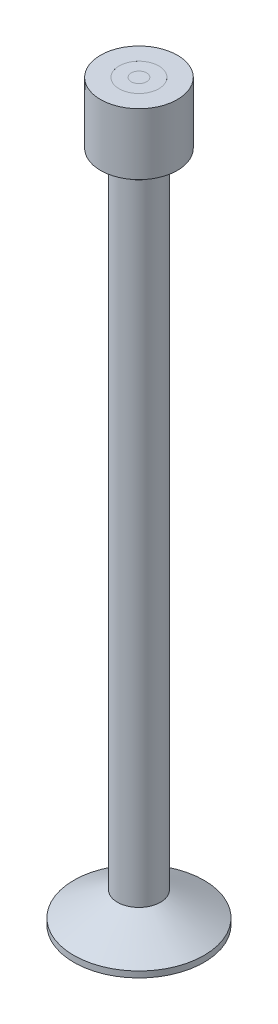
ISO-10303-21;
HEADER;
FILE_DESCRIPTION(('STEP AP214'),'2;1');
FILE_NAME('part.step','',(''),(''),'','','');
FILE_SCHEMA(('AUTOMOTIVE_DESIGN { 1 0 10303 214 1 1 1 1 }'));
ENDSEC;
DATA;
#1=APPLICATION_CONTEXT('core data for automotive mechanical design processes');
#2=APPLICATION_PROTOCOL_DEFINITION('international standard','automotive_design',2000,#1);
#3=PRODUCT_CONTEXT('',#1,'mechanical');
#4=PRODUCT('Part','Part','',(#3));
#5=PRODUCT_RELATED_PRODUCT_CATEGORY('part','',(#4));
#6=PRODUCT_DEFINITION_FORMATION('','',#4);
#7=PRODUCT_DEFINITION_CONTEXT('part definition',#1,'design');
#8=PRODUCT_DEFINITION('design','',#6,#7);
#9=PRODUCT_DEFINITION_SHAPE('','',#8);
#10=(LENGTH_UNIT() NAMED_UNIT(*) SI_UNIT(.MILLI.,.METRE.));
#11=(NAMED_UNIT(*) PLANE_ANGLE_UNIT() SI_UNIT($,.RADIAN.));
#12=(NAMED_UNIT(*) SI_UNIT($,.STERADIAN.) SOLID_ANGLE_UNIT());
#13=UNCERTAINTY_MEASURE_WITH_UNIT(LENGTH_MEASURE(1.E-05),#10,'distance_accuracy_value','');
#14=(GEOMETRIC_REPRESENTATION_CONTEXT(3) GLOBAL_UNCERTAINTY_ASSIGNED_CONTEXT((#13)) GLOBAL_UNIT_ASSIGNED_CONTEXT((#10,
#11,#12)) REPRESENTATION_CONTEXT('',''));
#15=CARTESIAN_POINT('',(0.,0.,0.));
#16=DIRECTION('',(0.,0.,1.));
#17=DIRECTION('',(1.,0.,0.));
#18=AXIS2_PLACEMENT_3D('',#15,#16,#17);
#19=CARTESIAN_POINT('',(1.37500000000001,0.100000000000002,0.));
#20=DIRECTION('',(0.,1.,0.));
#21=DIRECTION('',(0.,0.,1.));
#22=AXIS2_PLACEMENT_3D('',#19,#20,#21);
#23=PLANE('',#22);
#24=CARTESIAN_POINT('',(0.,0.100000000000002,0.));
#25=DIRECTION('',(0.,1.,0.));
#26=DIRECTION('',(0.,0.,1.));
#27=AXIS2_PLACEMENT_3D('',#24,#25,#26);
#28=CIRCLE('',#27,1.37500000000001);
#29=CARTESIAN_POINT('',(0.,0.100000000000002,1.37500000000001));
#30=VERTEX_POINT('',#29);
#31=EDGE_CURVE('E11',#30,#30,#28,.F.);
#32=ORIENTED_EDGE('',*,*,#31,.F.);
#33=EDGE_LOOP('',(#32));
#34=FACE_BOUND('',#33,.T.);
#35=ADVANCED_FACE('F42',(#34),#23,.T.);
#36=CARTESIAN_POINT('',(0.,0.,0.));
#37=DIRECTION('',(0.,-1.,0.));
#38=DIRECTION('',(1.,0.,0.));
#39=AXIS2_PLACEMENT_3D('',#36,#37,#38);
#40=PLANE('',#39);
#41=CARTESIAN_POINT('',(0.,0.,0.));
#42=DIRECTION('',(0.,-1.,0.));
#43=DIRECTION('',(1.,0.,0.));
#44=AXIS2_PLACEMENT_3D('',#41,#42,#43);
#45=CIRCLE('',#44,1.37500000000001);
#46=CARTESIAN_POINT('',(1.37500000000001,0.,0.));
#47=VERTEX_POINT('',#46);
#48=EDGE_CURVE('E48',#47,#47,#45,.T.);
#49=ORIENTED_EDGE('',*,*,#48,.T.);
#50=EDGE_LOOP('',(#49));
#51=FACE_BOUND('',#50,.T.);
#52=ADVANCED_FACE('F54',(#51),#40,.T.);
#53=CARTESIAN_POINT('',(0.,3.98908729652604,0.));
#54=DIRECTION('',(0.,-1.,0.));
#55=DIRECTION('',(1.,0.,0.));
#56=AXIS2_PLACEMENT_3D('',#53,#54,#55);
#57=CYLINDRICAL_SURFACE('',#56,1.37500000000001);
#58=ORIENTED_EDGE('',*,*,#48,.F.);
#59=EDGE_LOOP('',(#58));
#60=FACE_BOUND('',#59,.T.);
#61=ORIENTED_EDGE('',*,*,#31,.T.);
#62=EDGE_LOOP('',(#61));
#63=FACE_BOUND('',#62,.T.);
#64=ADVANCED_FACE('F56',(#60,#63),#57,.T.);
#65=CLOSED_SHELL('',(#35,#52,#64));
#66=MANIFOLD_SOLID_BREP('B2',#65);
#67=CARTESIAN_POINT('',(0.,55.5,0.));
#68=DIRECTION('',(0.,1.,0.));
#69=DIRECTION('',(0.,0.,1.));
#70=AXIS2_PLACEMENT_3D('',#67,#68,#69);
#71=CYLINDRICAL_SURFACE('',#70,0.375);
#72=CARTESIAN_POINT('',(0.,0.100000000000003,0.));
#73=DIRECTION('',(0.,1.,0.));
#74=DIRECTION('',(0.,0.,1.));
#75=AXIS2_PLACEMENT_3D('',#72,#73,#74);
#76=CIRCLE('',#75,0.375);
#77=CARTESIAN_POINT('',(0.,0.100000000000003,0.375));
#78=VERTEX_POINT('',#77);
#79=EDGE_CURVE('E113',#78,#78,#76,.T.);
#80=ORIENTED_EDGE('',*,*,#79,.F.);
#81=EDGE_LOOP('',(#80));
#82=FACE_BOUND('',#81,.T.);
#83=CARTESIAN_POINT('',(0.,54.9421933085502,0.));
#84=DIRECTION('',(0.,1.,0.));
#85=DIRECTION('',(0.,0.,1.));
#86=AXIS2_PLACEMENT_3D('',#83,#84,#85);
#87=CIRCLE('',#86,0.375);
#88=CARTESIAN_POINT('',(0.,54.9421933085502,0.375));
#89=VERTEX_POINT('',#88);
#90=EDGE_CURVE('E41',#89,#89,#87,.T.);
#91=ORIENTED_EDGE('',*,*,#90,.T.);
#92=EDGE_LOOP('',(#91));
#93=FACE_BOUND('',#92,.T.);
#94=ADVANCED_FACE('F91',(#82,#93),#71,.F.);
#95=CARTESIAN_POINT('',(0.,60.571,0.));
#96=DIRECTION('',(0.,1.,0.));
#97=DIRECTION('',(0.,0.,1.));
#98=AXIS2_PLACEMENT_3D('',#95,#96,#97);
#99=CONICAL_SURFACE('',#98,0.635000000000092,0.0461581536129454);
#100=ORIENTED_EDGE('',*,*,#90,.F.);
#101=EDGE_LOOP('',(#100));
#102=FACE_BOUND('',#101,.T.);
#103=CARTESIAN_POINT('',(0.,60.571,0.));
#104=DIRECTION('',(0.,1.,0.));
#105=DIRECTION('',(0.,0.,1.));
#106=AXIS2_PLACEMENT_3D('',#103,#104,#105);
#107=CIRCLE('',#106,0.635000000000092);
#108=CARTESIAN_POINT('',(0.,60.571,0.635000000000092));
#109=VERTEX_POINT('',#108);
#110=EDGE_CURVE('E97',#109,#109,#107,.T.);
#111=ORIENTED_EDGE('',*,*,#110,.T.);
#112=EDGE_LOOP('',(#111));
#113=FACE_BOUND('',#112,.T.);
#114=ADVANCED_FACE('F120',(#102,#113),#99,.F.);
#115=CARTESIAN_POINT('',(0.635000000000092,60.571,0.));
#116=DIRECTION('',(0.,-1.,0.));
#117=DIRECTION('',(0.,0.,-1.));
#118=AXIS2_PLACEMENT_3D('',#115,#116,#117);
#119=PLANE('',#118);
#120=ORIENTED_EDGE('',*,*,#110,.F.);
#121=EDGE_LOOP('',(#120));
#122=FACE_BOUND('',#121,.T.);
#123=CARTESIAN_POINT('',(0.,60.571,0.));
#124=DIRECTION('',(0.,1.,0.));
#125=DIRECTION('',(0.,0.,1.));
#126=AXIS2_PLACEMENT_3D('',#123,#124,#125);
#127=CIRCLE('',#126,1.63500000000009);
#128=CARTESIAN_POINT('',(0.,60.571,1.63500000000009));
#129=VERTEX_POINT('',#128);
#130=EDGE_CURVE('E101',#129,#129,#127,.T.);
#131=ORIENTED_EDGE('',*,*,#130,.T.);
#132=EDGE_LOOP('',(#131));
#133=FACE_BOUND('',#132,.T.);
#134=ADVANCED_FACE('F124',(#122,#133),#119,.F.);
#135=CARTESIAN_POINT('',(0.,54.9421933085502,0.));
#136=DIRECTION('',(0.,1.,0.));
#137=DIRECTION('',(0.,0.,1.));
#138=AXIS2_PLACEMENT_3D('',#135,#136,#137);
#139=CONICAL_SURFACE('',#138,1.37500000000001,0.0461581536129434);
#140=ORIENTED_EDGE('',*,*,#130,.F.);
#141=EDGE_LOOP('',(#140));
#142=FACE_BOUND('',#141,.T.);
#143=CARTESIAN_POINT('',(0.,54.9421933085502,0.));
#144=DIRECTION('',(0.,1.,0.));
#145=DIRECTION('',(0.,0.,1.));
#146=AXIS2_PLACEMENT_3D('',#143,#144,#145);
#147=CIRCLE('',#146,1.37500000000001);
#148=CARTESIAN_POINT('',(0.,54.9421933085502,1.37500000000001));
#149=VERTEX_POINT('',#148);
#150=EDGE_CURVE('E105',#149,#149,#147,.T.);
#151=ORIENTED_EDGE('',*,*,#150,.T.);
#152=EDGE_LOOP('',(#151));
#153=FACE_BOUND('',#152,.T.);
#154=ADVANCED_FACE('F129',(#142,#153),#139,.T.);
#155=CARTESIAN_POINT('',(0.,55.5,0.));
#156=DIRECTION('',(0.,1.,0.));
#157=DIRECTION('',(0.,0.,1.));
#158=AXIS2_PLACEMENT_3D('',#155,#156,#157);
#159=CYLINDRICAL_SURFACE('',#158,1.37500000000001);
#160=ORIENTED_EDGE('',*,*,#150,.F.);
#161=EDGE_LOOP('',(#160));
#162=FACE_BOUND('',#161,.T.);
#163=CARTESIAN_POINT('',(0.,0.100000000000003,0.));
#164=DIRECTION('',(0.,1.,0.));
#165=DIRECTION('',(0.,0.,1.));
#166=AXIS2_PLACEMENT_3D('',#163,#164,#165);
#167=CIRCLE('',#166,1.37500000000001);
#168=CARTESIAN_POINT('',(0.,0.100000000000003,1.37500000000001));
#169=VERTEX_POINT('',#168);
#170=EDGE_CURVE('E110',#169,#169,#167,.T.);
#171=ORIENTED_EDGE('',*,*,#170,.T.);
#172=EDGE_LOOP('',(#171));
#173=FACE_BOUND('',#172,.T.);
#174=ADVANCED_FACE('F135',(#162,#173),#159,.T.);
#175=CARTESIAN_POINT('',(1.37500000000001,0.100000000000002,0.));
#176=DIRECTION('',(0.,1.,0.));
#177=DIRECTION('',(0.,0.,1.));
#178=AXIS2_PLACEMENT_3D('',#175,#176,#177);
#179=PLANE('',#178);
#180=ORIENTED_EDGE('',*,*,#170,.F.);
#181=EDGE_LOOP('',(#180));
#182=FACE_BOUND('',#181,.T.);
#183=ORIENTED_EDGE('',*,*,#79,.T.);
#184=EDGE_LOOP('',(#183));
#185=FACE_BOUND('',#184,.T.);
#186=ADVANCED_FACE('F117',(#182,#185),#179,.F.);
#187=CLOSED_SHELL('',(#94,#114,#134,#154,#174,#186));
#188=MANIFOLD_SOLID_BREP('B6',#187);
#189=CARTESIAN_POINT('',(1.37500000000001,0.,0.));
#190=DIRECTION('',(0.,1.,0.));
#191=DIRECTION('',(-1.,0.,0.));
#192=AXIS2_PLACEMENT_3D('',#189,#190,#191);
#193=PLANE('',#192);
#194=CARTESIAN_POINT('',(0.,0.,0.));
#195=DIRECTION('',(0.,1.,0.));
#196=DIRECTION('',(-1.,0.,0.));
#197=AXIS2_PLACEMENT_3D('',#194,#195,#196);
#198=CIRCLE('',#197,5.37499999999999);
#199=CARTESIAN_POINT('',(-5.37499999999999,0.,0.));
#200=VERTEX_POINT('',#199);
#201=EDGE_CURVE('E90',#200,#200,#198,.T.);
#202=ORIENTED_EDGE('',*,*,#201,.F.);
#203=EDGE_LOOP('',(#202));
#204=FACE_BOUND('',#203,.T.);
#205=CARTESIAN_POINT('',(0.,0.,0.));
#206=DIRECTION('',(0.,1.,0.));
#207=DIRECTION('',(-1.,0.,0.));
#208=AXIS2_PLACEMENT_3D('',#205,#206,#207);
#209=CIRCLE('',#208,1.375);
#210=CARTESIAN_POINT('',(-1.37499999999999,0.,0.));
#211=VERTEX_POINT('',#210);
#212=EDGE_CURVE('E221',#211,#211,#209,.T.);
#213=ORIENTED_EDGE('',*,*,#212,.T.);
#214=EDGE_LOOP('',(#213));
#215=FACE_BOUND('',#214,.T.);
#216=ADVANCED_FACE('F190',(#204,#215),#193,.F.);
#217=CARTESIAN_POINT('',(0.,60.571,0.));
#218=DIRECTION('',(0.,1.,0.));
#219=DIRECTION('',(-1.,0.,0.));
#220=AXIS2_PLACEMENT_3D('',#217,#218,#219);
#221=CYLINDRICAL_SURFACE('',#220,5.37499999999999);
#222=CARTESIAN_POINT('',(0.,0.5,0.));
#223=DIRECTION('',(0.,1.,0.));
#224=DIRECTION('',(-1.,0.,0.));
#225=AXIS2_PLACEMENT_3D('',#222,#223,#224);
#226=CIRCLE('',#225,5.37499999999999);
#227=CARTESIAN_POINT('',(5.375,0.500000000000001,0.));
#228=VERTEX_POINT('',#227);
#229=EDGE_CURVE('E196',#228,#228,#226,.T.);
#230=ORIENTED_EDGE('',*,*,#229,.F.);
#231=EDGE_LOOP('',(#230));
#232=FACE_BOUND('',#231,.T.);
#233=ORIENTED_EDGE('',*,*,#201,.T.);
#234=EDGE_LOOP('',(#233));
#235=FACE_BOUND('',#234,.T.);
#236=ADVANCED_FACE('F264',(#232,#235),#221,.T.);
#237=CARTESIAN_POINT('',(0.,0.5,0.));
#238=DIRECTION('',(0.,-1.,0.));
#239=DIRECTION('',(1.,0.,0.));
#240=AXIS2_PLACEMENT_3D('',#237,#238,#239);
#241=CONICAL_SURFACE('',#240,5.37499999999999,1.06310757338599);
#242=CARTESIAN_POINT('',(0.,2.5,0.));
#243=DIRECTION('',(0.,1.,0.));
#244=DIRECTION('',(-1.,0.,0.));
#245=AXIS2_PLACEMENT_3D('',#242,#243,#244);
#246=CIRCLE('',#245,1.77999999999999);
#247=CARTESIAN_POINT('',(1.78,2.5,0.));
#248=VERTEX_POINT('',#247);
#249=EDGE_CURVE('E200',#248,#248,#246,.T.);
#250=CARTESIAN_POINT('',(1.78,2.5,0.));
#251=CARTESIAN_POINT('',(1.81744791666667,2.47916666666667,0.));
#252=CARTESIAN_POINT('',(1.85489583333333,2.45833333333334,0.));
#253=CARTESIAN_POINT('',(1.92979166666667,2.41666666666667,0.));
#254=CARTESIAN_POINT('',(1.96723958333333,2.39583333333334,0.));
#255=CARTESIAN_POINT('',(2.04213541666667,2.35416666666667,0.));
#256=CARTESIAN_POINT('',(2.07958333333333,2.33333333333334,0.));
#257=CARTESIAN_POINT('',(2.15447916666667,2.29166666666667,0.));
#258=CARTESIAN_POINT('',(2.19192708333333,2.27083333333334,0.));
#259=CARTESIAN_POINT('',(2.26682291666667,2.22916666666667,0.));
#260=CARTESIAN_POINT('',(2.30427083333333,2.20833333333334,0.));
#261=CARTESIAN_POINT('',(2.37916666666667,2.16666666666667,0.));
#262=CARTESIAN_POINT('',(2.41661458333334,2.14583333333334,0.));
#263=CARTESIAN_POINT('',(2.49151041666667,2.10416666666667,0.));
#264=CARTESIAN_POINT('',(2.52895833333333,2.08333333333334,0.));
#265=CARTESIAN_POINT('',(2.60385416666667,2.04166666666667,0.));
#266=CARTESIAN_POINT('',(2.64130208333333,2.02083333333334,0.));
#267=CARTESIAN_POINT('',(2.71619791666667,1.97916666666667,0.));
#268=CARTESIAN_POINT('',(2.75364583333333,1.95833333333334,0.));
#269=CARTESIAN_POINT('',(2.82854166666667,1.91666666666667,0.));
#270=CARTESIAN_POINT('',(2.86598958333333,1.89583333333334,0.));
#271=CARTESIAN_POINT('',(2.94088541666667,1.85416666666667,0.));
#272=CARTESIAN_POINT('',(2.97833333333333,1.83333333333334,0.));
#273=CARTESIAN_POINT('',(3.05322916666667,1.79166666666667,0.));
#274=CARTESIAN_POINT('',(3.09067708333333,1.77083333333334,0.));
#275=CARTESIAN_POINT('',(3.16557291666667,1.72916666666667,0.));
#276=CARTESIAN_POINT('',(3.20302083333333,1.70833333333334,0.));
#277=CARTESIAN_POINT('',(3.27791666666667,1.66666666666667,0.));
#278=CARTESIAN_POINT('',(3.31536458333333,1.64583333333334,0.));
#279=CARTESIAN_POINT('',(3.39026041666667,1.60416666666667,0.));
#280=CARTESIAN_POINT('',(3.42770833333333,1.58333333333334,0.));
#281=CARTESIAN_POINT('',(3.50260416666667,1.54166666666667,0.));
#282=CARTESIAN_POINT('',(3.54005208333333,1.52083333333334,0.));
#283=CARTESIAN_POINT('',(3.61494791666667,1.47916666666667,0.));
#284=CARTESIAN_POINT('',(3.65239583333333,1.45833333333334,0.));
#285=CARTESIAN_POINT('',(3.72729166666667,1.41666666666667,0.));
#286=CARTESIAN_POINT('',(3.76473958333333,1.39583333333334,0.));
#287=CARTESIAN_POINT('',(3.83963541666667,1.35416666666667,0.));
#288=CARTESIAN_POINT('',(3.87708333333333,1.33333333333334,0.));
#289=CARTESIAN_POINT('',(3.95197916666667,1.29166666666667,0.));
#290=CARTESIAN_POINT('',(3.98942708333333,1.27083333333334,0.));
#291=CARTESIAN_POINT('',(4.06432291666667,1.22916666666667,0.));
#292=CARTESIAN_POINT('',(4.10177083333333,1.20833333333333,0.));
#293=CARTESIAN_POINT('',(4.17666666666667,1.16666666666667,0.));
#294=CARTESIAN_POINT('',(4.21411458333333,1.14583333333333,0.));
#295=CARTESIAN_POINT('',(4.28901041666667,1.10416666666667,0.));
#296=CARTESIAN_POINT('',(4.32645833333333,1.08333333333333,0.));
#297=CARTESIAN_POINT('',(4.40135416666667,1.04166666666667,0.));
#298=CARTESIAN_POINT('',(4.43880208333333,1.02083333333333,0.));
#299=CARTESIAN_POINT('',(4.51369791666667,0.979166666666668,0.));
#300=CARTESIAN_POINT('',(4.55114583333333,0.958333333333335,0.));
#301=CARTESIAN_POINT('',(4.62604166666667,0.916666666666668,0.));
#302=CARTESIAN_POINT('',(4.66348958333333,0.895833333333335,0.));
#303=CARTESIAN_POINT('',(4.73838541666667,0.854166666666668,0.));
#304=CARTESIAN_POINT('',(4.77583333333333,0.833333333333335,0.));
#305=CARTESIAN_POINT('',(4.85072916666667,0.791666666666668,0.));
#306=CARTESIAN_POINT('',(4.88817708333333,0.770833333333334,0.));
#307=CARTESIAN_POINT('',(4.96307291666667,0.729166666666668,0.));
#308=CARTESIAN_POINT('',(5.00052083333333,0.708333333333335,0.));
#309=CARTESIAN_POINT('',(5.07541666666667,0.666666666666668,0.));
#310=CARTESIAN_POINT('',(5.11286458333333,0.645833333333334,0.));
#311=CARTESIAN_POINT('',(5.18776041666667,0.604166666666668,0.));
#312=CARTESIAN_POINT('',(5.22520833333333,0.583333333333334,0.));
#313=CARTESIAN_POINT('',(5.30010416666667,0.541666666666668,0.));
#314=CARTESIAN_POINT('',(5.33755208333333,0.520833333333335,0.));
#315=CARTESIAN_POINT('',(5.375,0.500000000000001,0.));
#316=B_SPLINE_CURVE_WITH_KNOTS('',3,(#250,#251,#252,#253,#254,#255,#256,#257,#258,#259,#260,
#261,#262,#263,#264,#265,#266,#267,#268,#269,#270,#271,#272,#273,#274,#275,#276,#277,#278,#279,
#280,#281,#282,#283,#284,#285,#286,#287,#288,#289,#290,#291,#292,#293,#294,#295,#296,#297,#298,
#299,#300,#301,#302,#303,#304,#305,#306,#307,#308,#309,#310,#311,#312,#313,#314,#315),
.UNSPECIFIED.,.F.,.F.,(4,2,2,2,2,2,2,2,2,2,2,2,2,2,2,2,2,2,2,2,2,2,2,2,2,2,2,2,2,2,2,2,4),(0.,
0.128558812082496,0.257117624164992,0.385676436247487,0.514235248329984,0.64279406041248,
0.771352872494976,0.899911684577471,1.02847049665997,1.15702930874246,1.28558812082496,
1.41414693290746,1.54270574498995,1.67126455707245,1.79982336915494,1.92838218123744,
2.05694099331994,2.18549980540243,2.31405861748493,2.44261742956742,2.57117624164992,
2.69973505373241,2.82829386581491,2.9568526778974,3.0854114899799,3.2139703020624,
3.34252911414489,3.47108792622739,3.59964673830988,3.72820555039238,3.85676436247488,
3.98532317455737,4.11388198663987),.UNSPECIFIED.);
#317=EDGE_CURVE('BSEAM259',#248,#228,#316,.T.);
#318=ORIENTED_EDGE('',*,*,#249,.F.);
#319=ORIENTED_EDGE('',*,*,#229,.T.);
#320=ORIENTED_EDGE('',*,*,#317,.T.);
#321=ORIENTED_EDGE('',*,*,#317,.F.);
#322=EDGE_LOOP('',(#318,#320,#319,#321));
#323=FACE_BOUND('',#322,.T.);
#324=ADVANCED_FACE('F259',(#323),#241,.T.);
#325=CARTESIAN_POINT('',(0.,60.571,0.));
#326=DIRECTION('',(0.,1.,0.));
#327=DIRECTION('',(-1.,0.,0.));
#328=AXIS2_PLACEMENT_3D('',#325,#326,#327);
#329=CYLINDRICAL_SURFACE('',#328,1.78);
#330=CARTESIAN_POINT('',(0.,54.5,0.));
#331=DIRECTION('',(0.,1.,0.));
#332=DIRECTION('',(-1.,0.,0.));
#333=AXIS2_PLACEMENT_3D('',#330,#331,#332);
#334=CIRCLE('',#333,1.78);
#335=CARTESIAN_POINT('',(-1.78,54.5,0.));
#336=VERTEX_POINT('',#335);
#337=EDGE_CURVE('E204',#336,#336,#334,.T.);
#338=ORIENTED_EDGE('',*,*,#337,.F.);
#339=EDGE_LOOP('',(#338));
#340=FACE_BOUND('',#339,.T.);
#341=ORIENTED_EDGE('',*,*,#249,.T.);
#342=EDGE_LOOP('',(#341));
#343=FACE_BOUND('',#342,.T.);
#344=ADVANCED_FACE('F253',(#340,#343),#329,.T.);
#345=CARTESIAN_POINT('',(0.,54.5,0.));
#346=DIRECTION('',(0.,1.,0.));
#347=DIRECTION('',(-1.,0.,0.));
#348=AXIS2_PLACEMENT_3D('',#345,#346,#347);
#349=CONICAL_SURFACE('',#348,1.78,0.947760988153379);
#350=CARTESIAN_POINT('',(0.,55.5,0.));
#351=DIRECTION('',(0.,1.,0.));
#352=DIRECTION('',(-1.,0.,0.));
#353=AXIS2_PLACEMENT_3D('',#350,#351,#352);
#354=CIRCLE('',#353,3.17178589149484);
#355=CARTESIAN_POINT('',(-3.17178589149484,55.5,0.));
#356=VERTEX_POINT('',#355);
#357=EDGE_CURVE('E209',#356,#356,#354,.T.);
#358=ORIENTED_EDGE('',*,*,#357,.F.);
#359=EDGE_LOOP('',(#358));
#360=FACE_BOUND('',#359,.T.);
#361=ORIENTED_EDGE('',*,*,#337,.T.);
#362=EDGE_LOOP('',(#361));
#363=FACE_BOUND('',#362,.T.);
#364=ADVANCED_FACE('F247',(#360,#363),#349,.T.);
#365=CARTESIAN_POINT('',(0.,60.571,0.));
#366=DIRECTION('',(0.,1.,0.));
#367=DIRECTION('',(-1.,0.,0.));
#368=AXIS2_PLACEMENT_3D('',#365,#366,#367);
#369=CYLINDRICAL_SURFACE('',#368,3.17178589149484);
#370=CARTESIAN_POINT('',(0.,60.571,0.));
#371=DIRECTION('',(0.,1.,0.));
#372=DIRECTION('',(-1.,0.,0.));
#373=AXIS2_PLACEMENT_3D('',#370,#371,#372);
#374=CIRCLE('',#373,3.17178589149484);
#375=CARTESIAN_POINT('',(-3.17178589149484,60.571,0.));
#376=VERTEX_POINT('',#375);
#377=EDGE_CURVE('E212',#376,#376,#374,.T.);
#378=ORIENTED_EDGE('',*,*,#377,.F.);
#379=EDGE_LOOP('',(#378));
#380=FACE_BOUND('',#379,.T.);
#381=ORIENTED_EDGE('',*,*,#357,.T.);
#382=EDGE_LOOP('',(#381));
#383=FACE_BOUND('',#382,.T.);
#384=ADVANCED_FACE('F241',(#380,#383),#369,.T.);
#385=CARTESIAN_POINT('',(3.17178589149484,60.571,0.));
#386=DIRECTION('',(0.,-1.,0.));
#387=DIRECTION('',(1.,0.,0.));
#388=AXIS2_PLACEMENT_3D('',#385,#386,#387);
#389=PLANE('',#388);
#390=CARTESIAN_POINT('',(0.,60.571,0.));
#391=DIRECTION('',(0.,1.,0.));
#392=DIRECTION('',(-1.,0.,0.));
#393=AXIS2_PLACEMENT_3D('',#390,#391,#392);
#394=CIRCLE('',#393,1.63500000000009);
#395=CARTESIAN_POINT('',(-1.63500000000009,60.571,0.));
#396=VERTEX_POINT('',#395);
#397=EDGE_CURVE('E215',#396,#396,#394,.T.);
#398=ORIENTED_EDGE('',*,*,#397,.F.);
#399=EDGE_LOOP('',(#398));
#400=FACE_BOUND('',#399,.T.);
#401=ORIENTED_EDGE('',*,*,#377,.T.);
#402=EDGE_LOOP('',(#401));
#403=FACE_BOUND('',#402,.T.);
#404=ADVANCED_FACE('F235',(#400,#403),#389,.F.);
#405=CARTESIAN_POINT('',(0.,60.571,0.));
#406=DIRECTION('',(0.,1.,0.));
#407=DIRECTION('',(-1.,0.,0.));
#408=AXIS2_PLACEMENT_3D('',#405,#406,#407);
#409=CONICAL_SURFACE('',#408,1.63500000000009,0.0461581536129435);
#410=CARTESIAN_POINT('',(0.,54.9421933085502,0.));
#411=DIRECTION('',(0.,1.,0.));
#412=DIRECTION('',(-1.,0.,0.));
#413=AXIS2_PLACEMENT_3D('',#410,#411,#412);
#414=CIRCLE('',#413,1.37500000000001);
#415=CARTESIAN_POINT('',(-1.37500000000001,54.9421933085502,0.));
#416=VERTEX_POINT('',#415);
#417=EDGE_CURVE('E218',#416,#416,#414,.T.);
#418=ORIENTED_EDGE('',*,*,#417,.F.);
#419=EDGE_LOOP('',(#418));
#420=FACE_BOUND('',#419,.T.);
#421=ORIENTED_EDGE('',*,*,#397,.T.);
#422=EDGE_LOOP('',(#421));
#423=FACE_BOUND('',#422,.T.);
#424=ADVANCED_FACE('F229',(#420,#423),#409,.F.);
#425=CARTESIAN_POINT('',(0.,60.571,0.));
#426=DIRECTION('',(0.,1.,0.));
#427=DIRECTION('',(-1.,0.,0.));
#428=AXIS2_PLACEMENT_3D('',#425,#426,#427);
#429=CYLINDRICAL_SURFACE('',#428,1.375);
#430=ORIENTED_EDGE('',*,*,#212,.F.);
#431=EDGE_LOOP('',(#430));
#432=FACE_BOUND('',#431,.T.);
#433=ORIENTED_EDGE('',*,*,#417,.T.);
#434=EDGE_LOOP('',(#433));
#435=FACE_BOUND('',#434,.T.);
#436=ADVANCED_FACE('F226',(#432,#435),#429,.F.);
#437=CLOSED_SHELL('',(#216,#236,#324,#344,#364,#384,#404,#424,#436));
#438=MANIFOLD_SOLID_BREP('B36',#437);
#439=CARTESIAN_POINT('',(0.63500000000009,60.571,0.));
#440=DIRECTION('',(0.,-1.,0.));
#441=DIRECTION('',(1.,0.,0.));
#442=AXIS2_PLACEMENT_3D('',#439,#440,#441);
#443=PLANE('',#442);
#444=CARTESIAN_POINT('',(0.,60.571,0.));
#445=DIRECTION('',(0.,1.,0.));
#446=DIRECTION('',(-1.,0.,0.));
#447=AXIS2_PLACEMENT_3D('',#444,#445,#446);
#448=CIRCLE('',#447,0.63500000000009);
#449=CARTESIAN_POINT('',(-0.63500000000009,60.571,0.));
#450=VERTEX_POINT('',#449);
#451=EDGE_CURVE('E189',#450,#450,#448,.T.);
#452=ORIENTED_EDGE('',*,*,#451,.T.);
#453=EDGE_LOOP('',(#452));
#454=FACE_BOUND('',#453,.T.);
#455=ADVANCED_FACE('F331',(#454),#443,.F.);
#456=CARTESIAN_POINT('',(0.,54.9421933085502,0.));
#457=DIRECTION('',(0.,1.,0.));
#458=DIRECTION('',(-1.,0.,0.));
#459=AXIS2_PLACEMENT_3D('',#456,#457,#458);
#460=CONICAL_SURFACE('',#459,0.374999999999999,0.0461581536129452);
#461=ORIENTED_EDGE('',*,*,#451,.F.);
#462=EDGE_LOOP('',(#461));
#463=FACE_BOUND('',#462,.T.);
#464=CARTESIAN_POINT('',(0.,54.9421933085502,0.));
#465=DIRECTION('',(0.,1.,0.));
#466=DIRECTION('',(-1.,0.,0.));
#467=AXIS2_PLACEMENT_3D('',#464,#465,#466);
#468=CIRCLE('',#467,0.374999999999999);
#469=CARTESIAN_POINT('',(-0.374999999999999,54.9421933085502,0.));
#470=VERTEX_POINT('',#469);
#471=EDGE_CURVE('E337',#470,#470,#468,.T.);
#472=ORIENTED_EDGE('',*,*,#471,.T.);
#473=EDGE_LOOP('',(#472));
#474=FACE_BOUND('',#473,.T.);
#475=ADVANCED_FACE('F356',(#463,#474),#460,.T.);
#476=CARTESIAN_POINT('',(0.,60.571,0.));
#477=DIRECTION('',(0.,1.,0.));
#478=DIRECTION('',(-1.,0.,0.));
#479=AXIS2_PLACEMENT_3D('',#476,#477,#478);
#480=CYLINDRICAL_SURFACE('',#479,0.374999999999996);
#481=ORIENTED_EDGE('',*,*,#471,.F.);
#482=EDGE_LOOP('',(#481));
#483=FACE_BOUND('',#482,.T.);
#484=CARTESIAN_POINT('',(0.,0.100000000000003,0.));
#485=DIRECTION('',(0.,1.,0.));
#486=DIRECTION('',(-1.,0.,0.));
#487=AXIS2_PLACEMENT_3D('',#484,#485,#486);
#488=CIRCLE('',#487,0.374999999999993);
#489=CARTESIAN_POINT('',(-0.374999999999985,0.100000000000003,0.));
#490=VERTEX_POINT('',#489);
#491=EDGE_CURVE('E341',#490,#490,#488,.T.);
#492=ORIENTED_EDGE('',*,*,#491,.T.);
#493=EDGE_LOOP('',(#492));
#494=FACE_BOUND('',#493,.T.);
#495=ADVANCED_FACE('F348',(#483,#494),#480,.T.);
#496=CARTESIAN_POINT('',(0.375,0.100000000000002,0.));
#497=DIRECTION('',(0.,1.,0.));
#498=DIRECTION('',(-1.,0.,0.));
#499=AXIS2_PLACEMENT_3D('',#496,#497,#498);
#500=PLANE('',#499);
#501=ORIENTED_EDGE('',*,*,#491,.F.);
#502=EDGE_LOOP('',(#501));
#503=FACE_BOUND('',#502,.T.);
#504=ADVANCED_FACE('F350',(#503),#500,.F.);
#505=CLOSED_SHELL('',(#455,#475,#495,#504));
#506=MANIFOLD_SOLID_BREP('B85',#505);
#507=ADVANCED_BREP_SHAPE_REPRESENTATION('',(#18,#66,#188,#438,#506),#14);
#508=SHAPE_DEFINITION_REPRESENTATION(#9,#507);
ENDSEC;
END-ISO-10303-21;
